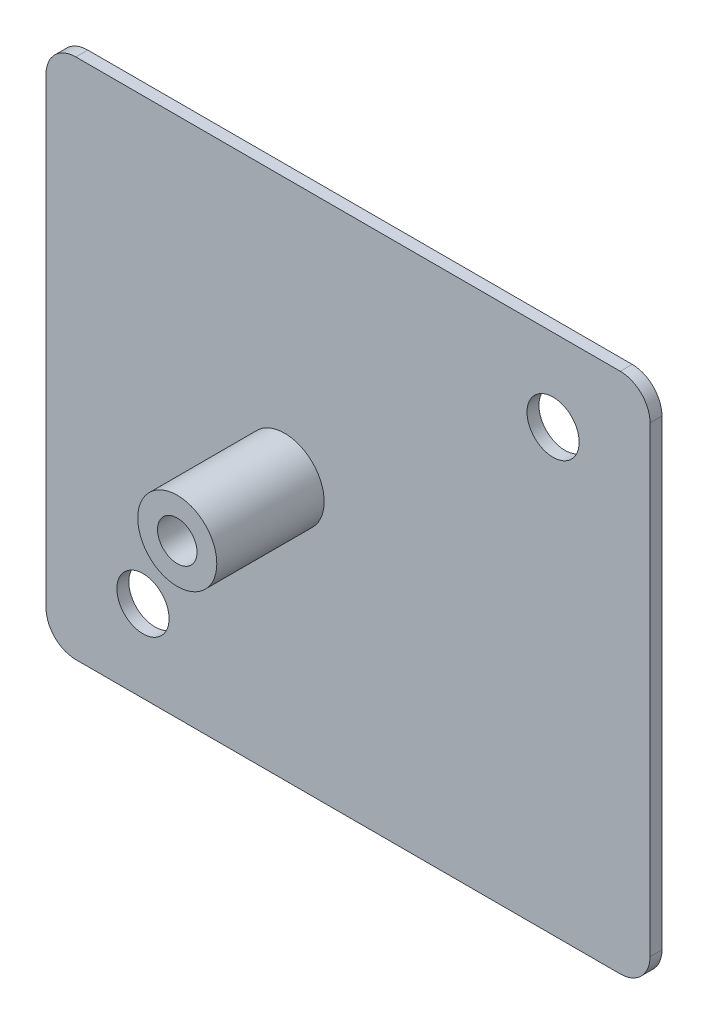
ISO-10303-21;
HEADER;
FILE_DESCRIPTION(('STEP AP214'),'2;1');
FILE_NAME('part.step','',(''),(''),'','','');
FILE_SCHEMA(('AUTOMOTIVE_DESIGN { 1 0 10303 214 1 1 1 1 }'));
ENDSEC;
DATA;
#1=APPLICATION_CONTEXT('core data for automotive mechanical design processes');
#2=APPLICATION_PROTOCOL_DEFINITION('international standard','automotive_design',2000,#1);
#3=PRODUCT_CONTEXT('',#1,'mechanical');
#4=PRODUCT('Part','Part','',(#3));
#5=PRODUCT_RELATED_PRODUCT_CATEGORY('part','',(#4));
#6=PRODUCT_DEFINITION_FORMATION('','',#4);
#7=PRODUCT_DEFINITION_CONTEXT('part definition',#1,'design');
#8=PRODUCT_DEFINITION('design','',#6,#7);
#9=PRODUCT_DEFINITION_SHAPE('','',#8);
#10=(LENGTH_UNIT() NAMED_UNIT(*) SI_UNIT(.MILLI.,.METRE.));
#11=(NAMED_UNIT(*) PLANE_ANGLE_UNIT() SI_UNIT($,.RADIAN.));
#12=(NAMED_UNIT(*) SI_UNIT($,.STERADIAN.) SOLID_ANGLE_UNIT());
#13=UNCERTAINTY_MEASURE_WITH_UNIT(LENGTH_MEASURE(1.E-05),#10,'distance_accuracy_value','');
#14=(GEOMETRIC_REPRESENTATION_CONTEXT(3) GLOBAL_UNCERTAINTY_ASSIGNED_CONTEXT((#13)) GLOBAL_UNIT_ASSIGNED_CONTEXT((#10,
#11,#12)) REPRESENTATION_CONTEXT('',''));
#15=CARTESIAN_POINT('',(0.,0.,0.));
#16=DIRECTION('',(0.,0.,1.));
#17=DIRECTION('',(1.,0.,0.));
#18=AXIS2_PLACEMENT_3D('',#15,#16,#17);
#19=CARTESIAN_POINT('',(20.25,-17.5,-0.8));
#20=DIRECTION('',(1.,0.,0.));
#21=DIRECTION('',(0.,0.,-1.));
#22=AXIS2_PLACEMENT_3D('',#19,#20,#21);
#23=PLANE('',#22);
#24=DIRECTION('',(0.,1.,0.));
#25=VECTOR('',#24,1.);
#26=CARTESIAN_POINT('',(20.25,-17.5,0.));
#27=LINE('',#26,#25);
#28=CARTESIAN_POINT('',(20.25,-15.5,0.));
#29=VERTEX_POINT('',#28);
#30=CARTESIAN_POINT('',(20.25,15.5,0.));
#31=VERTEX_POINT('',#30);
#32=EDGE_CURVE('E90',#29,#31,#27,.T.);
#33=ORIENTED_EDGE('',*,*,#32,.F.);
#34=DIRECTION('',(0.,0.,1.));
#35=VECTOR('',#34,1.);
#36=CARTESIAN_POINT('',(20.25,-15.5,-0.8));
#37=LINE('',#36,#35);
#38=CARTESIAN_POINT('',(20.25,-15.5,-0.8));
#39=VERTEX_POINT('',#38);
#40=EDGE_CURVE('E25',#29,#39,#37,.F.);
#41=ORIENTED_EDGE('',*,*,#40,.T.);
#42=DIRECTION('',(0.,1.,0.));
#43=VECTOR('',#42,1.);
#44=CARTESIAN_POINT('',(20.25,-17.5,-0.8));
#45=LINE('',#44,#43);
#46=CARTESIAN_POINT('',(20.25,15.5,-0.8));
#47=VERTEX_POINT('',#46);
#48=EDGE_CURVE('E143',#39,#47,#45,.T.);
#49=ORIENTED_EDGE('',*,*,#48,.T.);
#50=DIRECTION('',(0.,0.,1.));
#51=VECTOR('',#50,1.);
#52=CARTESIAN_POINT('',(20.25,15.5,-0.8));
#53=LINE('',#52,#51);
#54=EDGE_CURVE('E140',#47,#31,#53,.T.);
#55=ORIENTED_EDGE('',*,*,#54,.T.);
#56=EDGE_LOOP('',(#33,#41,#49,#55));
#57=FACE_BOUND('',#56,.T.);
#58=ADVANCED_FACE('F17',(#57),#23,.T.);
#59=CARTESIAN_POINT('',(-20.25,-17.5,-0.8));
#60=DIRECTION('',(0.,-1.,0.));
#61=DIRECTION('',(0.,0.,-1.));
#62=AXIS2_PLACEMENT_3D('',#59,#60,#61);
#63=PLANE('',#62);
#64=DIRECTION('',(1.,0.,0.));
#65=VECTOR('',#64,1.);
#66=CARTESIAN_POINT('',(-20.25,-17.5,0.));
#67=LINE('',#66,#65);
#68=CARTESIAN_POINT('',(-18.25,-17.5,0.));
#69=VERTEX_POINT('',#68);
#70=CARTESIAN_POINT('',(18.25,-17.5,0.));
#71=VERTEX_POINT('',#70);
#72=EDGE_CURVE('E111',#69,#71,#67,.T.);
#73=ORIENTED_EDGE('',*,*,#72,.F.);
#74=DIRECTION('',(0.,0.,1.));
#75=VECTOR('',#74,1.);
#76=CARTESIAN_POINT('',(-18.25,-17.5,-0.8));
#77=LINE('',#76,#75);
#78=CARTESIAN_POINT('',(-18.25,-17.5,-0.8));
#79=VERTEX_POINT('',#78);
#80=EDGE_CURVE('E39',#69,#79,#77,.F.);
#81=ORIENTED_EDGE('',*,*,#80,.T.);
#82=DIRECTION('',(1.,0.,0.));
#83=VECTOR('',#82,1.);
#84=CARTESIAN_POINT('',(-20.25,-17.5,-0.8));
#85=LINE('',#84,#83);
#86=CARTESIAN_POINT('',(18.25,-17.5,-0.8));
#87=VERTEX_POINT('',#86);
#88=EDGE_CURVE('E107',#79,#87,#85,.T.);
#89=ORIENTED_EDGE('',*,*,#88,.T.);
#90=DIRECTION('',(0.,0.,1.));
#91=VECTOR('',#90,1.);
#92=CARTESIAN_POINT('',(18.25,-17.5,-0.8));
#93=LINE('',#92,#91);
#94=EDGE_CURVE('E132',#87,#71,#93,.T.);
#95=ORIENTED_EDGE('',*,*,#94,.T.);
#96=EDGE_LOOP('',(#73,#81,#89,#95));
#97=FACE_BOUND('',#96,.T.);
#98=ADVANCED_FACE('F147',(#97),#63,.T.);
#99=CARTESIAN_POINT('',(-20.25,-17.5,-0.8));
#100=DIRECTION('',(-1.,0.,0.));
#101=DIRECTION('',(0.,0.,1.));
#102=AXIS2_PLACEMENT_3D('',#99,#100,#101);
#103=PLANE('',#102);
#104=DIRECTION('',(0.,-1.,0.));
#105=VECTOR('',#104,1.);
#106=CARTESIAN_POINT('',(-20.25,-17.5,0.));
#107=LINE('',#106,#105);
#108=CARTESIAN_POINT('',(-20.25,15.5,0.));
#109=VERTEX_POINT('',#108);
#110=CARTESIAN_POINT('',(-20.25,-15.5,0.));
#111=VERTEX_POINT('',#110);
#112=EDGE_CURVE('E102',#109,#111,#107,.T.);
#113=ORIENTED_EDGE('',*,*,#112,.F.);
#114=DIRECTION('',(0.,0.,1.));
#115=VECTOR('',#114,1.);
#116=CARTESIAN_POINT('',(-20.25,15.5,-0.8));
#117=LINE('',#116,#115);
#118=CARTESIAN_POINT('',(-20.25,15.5,-0.8));
#119=VERTEX_POINT('',#118);
#120=EDGE_CURVE('E123',#109,#119,#117,.F.);
#121=ORIENTED_EDGE('',*,*,#120,.T.);
#122=DIRECTION('',(0.,-1.,0.));
#123=VECTOR('',#122,1.);
#124=CARTESIAN_POINT('',(-20.25,-17.5,-0.8));
#125=LINE('',#124,#123);
#126=CARTESIAN_POINT('',(-20.25,-15.5,-0.8));
#127=VERTEX_POINT('',#126);
#128=EDGE_CURVE('E112',#119,#127,#125,.T.);
#129=ORIENTED_EDGE('',*,*,#128,.T.);
#130=DIRECTION('',(0.,0.,1.));
#131=VECTOR('',#130,1.);
#132=CARTESIAN_POINT('',(-20.25,-15.5,-0.8));
#133=LINE('',#132,#131);
#134=EDGE_CURVE('E125',#127,#111,#133,.T.);
#135=ORIENTED_EDGE('',*,*,#134,.T.);
#136=EDGE_LOOP('',(#113,#121,#129,#135));
#137=FACE_BOUND('',#136,.T.);
#138=ADVANCED_FACE('F201',(#137),#103,.T.);
#139=CARTESIAN_POINT('',(-20.25,17.5,-0.8));
#140=DIRECTION('',(0.,1.,0.));
#141=DIRECTION('',(0.,0.,1.));
#142=AXIS2_PLACEMENT_3D('',#139,#140,#141);
#143=PLANE('',#142);
#144=DIRECTION('',(-1.,0.,0.));
#145=VECTOR('',#144,1.);
#146=CARTESIAN_POINT('',(-20.25,17.5,-0.8));
#147=LINE('',#146,#145);
#148=CARTESIAN_POINT('',(18.25,17.5,-0.8));
#149=VERTEX_POINT('',#148);
#150=CARTESIAN_POINT('',(-18.25,17.5,-0.8));
#151=VERTEX_POINT('',#150);
#152=EDGE_CURVE('E144',#149,#151,#147,.T.);
#153=ORIENTED_EDGE('',*,*,#152,.T.);
#154=DIRECTION('',(0.,0.,1.));
#155=VECTOR('',#154,1.);
#156=CARTESIAN_POINT('',(-18.25,17.5,-0.8));
#157=LINE('',#156,#155);
#158=CARTESIAN_POINT('',(-18.25,17.5,0.));
#159=VERTEX_POINT('',#158);
#160=EDGE_CURVE('E92',#151,#159,#157,.T.);
#161=ORIENTED_EDGE('',*,*,#160,.T.);
#162=DIRECTION('',(-1.,0.,0.));
#163=VECTOR('',#162,1.);
#164=CARTESIAN_POINT('',(-20.25,17.5,0.));
#165=LINE('',#164,#163);
#166=CARTESIAN_POINT('',(18.25,17.5,0.));
#167=VERTEX_POINT('',#166);
#168=EDGE_CURVE('E87',#167,#159,#165,.T.);
#169=ORIENTED_EDGE('',*,*,#168,.F.);
#170=DIRECTION('',(0.,0.,1.));
#171=VECTOR('',#170,1.);
#172=CARTESIAN_POINT('',(18.25,17.5,-0.8));
#173=LINE('',#172,#171);
#174=EDGE_CURVE('E101',#167,#149,#173,.F.);
#175=ORIENTED_EDGE('',*,*,#174,.T.);
#176=EDGE_LOOP('',(#153,#161,#169,#175));
#177=FACE_BOUND('',#176,.T.);
#178=ADVANCED_FACE('F99',(#177),#143,.T.);
#179=CARTESIAN_POINT('',(0.,0.,-0.8));
#180=DIRECTION('',(0.,0.,-1.));
#181=DIRECTION('',(-1.,0.,0.));
#182=AXIS2_PLACEMENT_3D('',#179,#180,#181);
#183=PLANE('',#182);
#184=CARTESIAN_POINT('',(-13.75,-12.,-0.8));
#185=DIRECTION('',(0.,0.,1.));
#186=DIRECTION('',(1.,0.,0.));
#187=AXIS2_PLACEMENT_3D('',#184,#185,#186);
#188=CIRCLE('',#187,1.75);
#189=CARTESIAN_POINT('',(-12.,-12.,-0.8));
#190=VERTEX_POINT('',#189);
#191=EDGE_CURVE('E165',#190,#190,#188,.T.);
#192=ORIENTED_EDGE('',*,*,#191,.T.);
#193=EDGE_LOOP('',(#192));
#194=FACE_BOUND('',#193,.T.);
#195=CARTESIAN_POINT('',(13.75,12.,-0.8));
#196=DIRECTION('',(0.,0.,1.));
#197=DIRECTION('',(1.,0.,0.));
#198=AXIS2_PLACEMENT_3D('',#195,#196,#197);
#199=CIRCLE('',#198,1.75);
#200=CARTESIAN_POINT('',(15.5,12.,-0.8));
#201=VERTEX_POINT('',#200);
#202=EDGE_CURVE('E152',#201,#201,#199,.T.);
#203=ORIENTED_EDGE('',*,*,#202,.T.);
#204=EDGE_LOOP('',(#203));
#205=FACE_BOUND('',#204,.T.);
#206=ORIENTED_EDGE('',*,*,#128,.F.);
#207=CARTESIAN_POINT('',(-18.25,15.5,-0.8));
#208=DIRECTION('',(0.,0.,-1.));
#209=DIRECTION('',(-1.,0.,0.));
#210=AXIS2_PLACEMENT_3D('',#207,#208,#209);
#211=CIRCLE('',#210,2.);
#212=EDGE_CURVE('E131',#119,#151,#211,.T.);
#213=ORIENTED_EDGE('',*,*,#212,.T.);
#214=ORIENTED_EDGE('',*,*,#152,.F.);
#215=CARTESIAN_POINT('',(18.25,15.5,-0.8));
#216=DIRECTION('',(0.,0.,-1.));
#217=DIRECTION('',(-1.,0.,0.));
#218=AXIS2_PLACEMENT_3D('',#215,#216,#217);
#219=CIRCLE('',#218,2.);
#220=EDGE_CURVE('E110',#149,#47,#219,.T.);
#221=ORIENTED_EDGE('',*,*,#220,.T.);
#222=ORIENTED_EDGE('',*,*,#48,.F.);
#223=CARTESIAN_POINT('',(18.25,-15.5,-0.8));
#224=DIRECTION('',(0.,0.,-1.));
#225=DIRECTION('',(-1.,0.,0.));
#226=AXIS2_PLACEMENT_3D('',#223,#224,#225);
#227=CIRCLE('',#226,2.);
#228=EDGE_CURVE('E32',#39,#87,#227,.T.);
#229=ORIENTED_EDGE('',*,*,#228,.T.);
#230=ORIENTED_EDGE('',*,*,#88,.F.);
#231=CARTESIAN_POINT('',(-18.25,-15.5,-0.8));
#232=DIRECTION('',(0.,0.,-1.));
#233=DIRECTION('',(-1.,0.,0.));
#234=AXIS2_PLACEMENT_3D('',#231,#232,#233);
#235=CIRCLE('',#234,2.);
#236=EDGE_CURVE('E127',#79,#127,#235,.T.);
#237=ORIENTED_EDGE('',*,*,#236,.T.);
#238=EDGE_LOOP('',(#206,#213,#214,#221,#222,#229,#230,#237));
#239=FACE_BOUND('',#238,.T.);
#240=ADVANCED_FACE('F145',(#194,#205,#239),#183,.T.);
#241=CARTESIAN_POINT('',(0.,0.,0.));
#242=DIRECTION('',(0.,0.,-1.));
#243=DIRECTION('',(-1.,0.,0.));
#244=AXIS2_PLACEMENT_3D('',#241,#242,#243);
#245=PLANE('',#244);
#246=CARTESIAN_POINT('',(-4.25,0.,0.));
#247=DIRECTION('',(0.,0.,-1.));
#248=DIRECTION('',(-1.,0.,0.));
#249=AXIS2_PLACEMENT_3D('',#246,#247,#248);
#250=CIRCLE('',#249,2.65);
#251=CARTESIAN_POINT('',(-6.9,0.,0.));
#252=VERTEX_POINT('',#251);
#253=EDGE_CURVE('E11',#252,#252,#250,.F.);
#254=ORIENTED_EDGE('',*,*,#253,.F.);
#255=EDGE_LOOP('',(#254));
#256=FACE_BOUND('',#255,.T.);
#257=CARTESIAN_POINT('',(-13.75,-12.,0.));
#258=DIRECTION('',(0.,0.,1.));
#259=DIRECTION('',(1.,0.,0.));
#260=AXIS2_PLACEMENT_3D('',#257,#258,#259);
#261=CIRCLE('',#260,1.75);
#262=CARTESIAN_POINT('',(-12.,-12.,0.));
#263=VERTEX_POINT('',#262);
#264=EDGE_CURVE('E164',#263,#263,#261,.T.);
#265=ORIENTED_EDGE('',*,*,#264,.F.);
#266=EDGE_LOOP('',(#265));
#267=FACE_BOUND('',#266,.T.);
#268=CARTESIAN_POINT('',(13.75,12.,0.));
#269=DIRECTION('',(0.,0.,1.));
#270=DIRECTION('',(1.,0.,0.));
#271=AXIS2_PLACEMENT_3D('',#268,#269,#270);
#272=CIRCLE('',#271,1.75);
#273=CARTESIAN_POINT('',(15.5,12.,0.));
#274=VERTEX_POINT('',#273);
#275=EDGE_CURVE('E157',#274,#274,#272,.T.);
#276=ORIENTED_EDGE('',*,*,#275,.F.);
#277=EDGE_LOOP('',(#276));
#278=FACE_BOUND('',#277,.T.);
#279=ORIENTED_EDGE('',*,*,#168,.T.);
#280=CARTESIAN_POINT('',(-18.25,15.5,0.));
#281=DIRECTION('',(0.,0.,-1.));
#282=DIRECTION('',(-1.,0.,0.));
#283=AXIS2_PLACEMENT_3D('',#280,#281,#282);
#284=CIRCLE('',#283,2.);
#285=EDGE_CURVE('E120',#159,#109,#284,.F.);
#286=ORIENTED_EDGE('',*,*,#285,.T.);
#287=ORIENTED_EDGE('',*,*,#112,.T.);
#288=CARTESIAN_POINT('',(-18.25,-15.5,0.));
#289=DIRECTION('',(0.,0.,-1.));
#290=DIRECTION('',(-1.,0.,0.));
#291=AXIS2_PLACEMENT_3D('',#288,#289,#290);
#292=CIRCLE('',#291,2.);
#293=EDGE_CURVE('E119',#111,#69,#292,.F.);
#294=ORIENTED_EDGE('',*,*,#293,.T.);
#295=ORIENTED_EDGE('',*,*,#72,.T.);
#296=CARTESIAN_POINT('',(18.25,-15.5,0.));
#297=DIRECTION('',(0.,0.,-1.));
#298=DIRECTION('',(-1.,0.,0.));
#299=AXIS2_PLACEMENT_3D('',#296,#297,#298);
#300=CIRCLE('',#299,2.);
#301=EDGE_CURVE('E94',#71,#29,#300,.F.);
#302=ORIENTED_EDGE('',*,*,#301,.T.);
#303=ORIENTED_EDGE('',*,*,#32,.T.);
#304=CARTESIAN_POINT('',(18.25,15.5,0.));
#305=DIRECTION('',(0.,0.,-1.));
#306=DIRECTION('',(-1.,0.,0.));
#307=AXIS2_PLACEMENT_3D('',#304,#305,#306);
#308=CIRCLE('',#307,2.);
#309=EDGE_CURVE('E81',#31,#167,#308,.F.);
#310=ORIENTED_EDGE('',*,*,#309,.T.);
#311=EDGE_LOOP('',(#279,#286,#287,#294,#295,#302,#303,#310));
#312=FACE_BOUND('',#311,.T.);
#313=ADVANCED_FACE('F88',(#256,#267,#278,#312),#245,.F.);
#314=CARTESIAN_POINT('',(13.75,12.,-0.8));
#315=DIRECTION('',(0.,0.,1.));
#316=DIRECTION('',(1.,0.,0.));
#317=AXIS2_PLACEMENT_3D('',#314,#315,#316);
#318=CYLINDRICAL_SURFACE('',#317,1.75);
#319=ORIENTED_EDGE('',*,*,#202,.F.);
#320=EDGE_LOOP('',(#319));
#321=FACE_BOUND('',#320,.T.);
#322=ORIENTED_EDGE('',*,*,#275,.T.);
#323=EDGE_LOOP('',(#322));
#324=FACE_BOUND('',#323,.T.);
#325=ADVANCED_FACE('F252',(#321,#324),#318,.F.);
#326=CARTESIAN_POINT('',(-13.75,-12.,-0.8));
#327=DIRECTION('',(0.,0.,1.));
#328=DIRECTION('',(1.,0.,0.));
#329=AXIS2_PLACEMENT_3D('',#326,#327,#328);
#330=CYLINDRICAL_SURFACE('',#329,1.75);
#331=ORIENTED_EDGE('',*,*,#191,.F.);
#332=EDGE_LOOP('',(#331));
#333=FACE_BOUND('',#332,.T.);
#334=ORIENTED_EDGE('',*,*,#264,.T.);
#335=EDGE_LOOP('',(#334));
#336=FACE_BOUND('',#335,.T.);
#337=ADVANCED_FACE('F215',(#333,#336),#330,.F.);
#338=CARTESIAN_POINT('',(-18.25,15.5,-0.8));
#339=DIRECTION('',(0.,0.,1.));
#340=DIRECTION('',(1.,0.,0.));
#341=AXIS2_PLACEMENT_3D('',#338,#339,#340);
#342=CYLINDRICAL_SURFACE('',#341,2.);
#343=ORIENTED_EDGE('',*,*,#212,.F.);
#344=ORIENTED_EDGE('',*,*,#120,.F.);
#345=ORIENTED_EDGE('',*,*,#285,.F.);
#346=ORIENTED_EDGE('',*,*,#160,.F.);
#347=EDGE_LOOP('',(#343,#344,#345,#346));
#348=FACE_BOUND('',#347,.T.);
#349=ADVANCED_FACE('F208',(#348),#342,.T.);
#350=CARTESIAN_POINT('',(-18.25,-15.5,-0.8));
#351=DIRECTION('',(0.,0.,1.));
#352=DIRECTION('',(1.,0.,0.));
#353=AXIS2_PLACEMENT_3D('',#350,#351,#352);
#354=CYLINDRICAL_SURFACE('',#353,2.);
#355=ORIENTED_EDGE('',*,*,#236,.F.);
#356=ORIENTED_EDGE('',*,*,#80,.F.);
#357=ORIENTED_EDGE('',*,*,#293,.F.);
#358=ORIENTED_EDGE('',*,*,#134,.F.);
#359=EDGE_LOOP('',(#355,#356,#357,#358));
#360=FACE_BOUND('',#359,.T.);
#361=ADVANCED_FACE('F211',(#360),#354,.T.);
#362=CARTESIAN_POINT('',(18.25,-15.5,-0.8));
#363=DIRECTION('',(0.,0.,1.));
#364=DIRECTION('',(1.,0.,0.));
#365=AXIS2_PLACEMENT_3D('',#362,#363,#364);
#366=CYLINDRICAL_SURFACE('',#365,2.);
#367=ORIENTED_EDGE('',*,*,#228,.F.);
#368=ORIENTED_EDGE('',*,*,#40,.F.);
#369=ORIENTED_EDGE('',*,*,#301,.F.);
#370=ORIENTED_EDGE('',*,*,#94,.F.);
#371=EDGE_LOOP('',(#367,#368,#369,#370));
#372=FACE_BOUND('',#371,.T.);
#373=ADVANCED_FACE('F146',(#372),#366,.T.);
#374=CARTESIAN_POINT('',(18.25,15.5,-0.8));
#375=DIRECTION('',(0.,0.,1.));
#376=DIRECTION('',(1.,0.,0.));
#377=AXIS2_PLACEMENT_3D('',#374,#375,#376);
#378=CYLINDRICAL_SURFACE('',#377,2.);
#379=ORIENTED_EDGE('',*,*,#220,.F.);
#380=ORIENTED_EDGE('',*,*,#174,.F.);
#381=ORIENTED_EDGE('',*,*,#309,.F.);
#382=ORIENTED_EDGE('',*,*,#54,.F.);
#383=EDGE_LOOP('',(#379,#380,#381,#382));
#384=FACE_BOUND('',#383,.T.);
#385=ADVANCED_FACE('F19',(#384),#378,.T.);
#386=CARTESIAN_POINT('',(-4.25,0.,7.2));
#387=DIRECTION('',(0.,0.,1.));
#388=DIRECTION('',(1.,0.,0.));
#389=AXIS2_PLACEMENT_3D('',#386,#387,#388);
#390=PLANE('',#389);
#391=CARTESIAN_POINT('',(-4.25,0.,7.2));
#392=DIRECTION('',(0.,0.,1.));
#393=DIRECTION('',(1.,0.,0.));
#394=AXIS2_PLACEMENT_3D('',#391,#392,#393);
#395=CIRCLE('',#394,2.65);
#396=CARTESIAN_POINT('',(-1.6,0.,7.2));
#397=VERTEX_POINT('',#396);
#398=EDGE_CURVE('E169',#397,#397,#395,.T.);
#399=ORIENTED_EDGE('',*,*,#398,.T.);
#400=EDGE_LOOP('',(#399));
#401=FACE_BOUND('',#400,.T.);
#402=CARTESIAN_POINT('',(-4.25,0.,7.2));
#403=DIRECTION('',(0.,0.,1.));
#404=DIRECTION('',(1.,0.,0.));
#405=AXIS2_PLACEMENT_3D('',#402,#403,#404);
#406=CIRCLE('',#405,1.325);
#407=CARTESIAN_POINT('',(-2.925,0.,7.2));
#408=VERTEX_POINT('',#407);
#409=EDGE_CURVE('E174',#408,#408,#406,.T.);
#410=ORIENTED_EDGE('',*,*,#409,.F.);
#411=EDGE_LOOP('',(#410));
#412=FACE_BOUND('',#411,.T.);
#413=ADVANCED_FACE('F183',(#401,#412),#390,.T.);
#414=CARTESIAN_POINT('',(-4.25,0.,7.2));
#415=DIRECTION('',(0.,0.,-1.));
#416=DIRECTION('',(-1.,0.,0.));
#417=AXIS2_PLACEMENT_3D('',#414,#415,#416);
#418=CYLINDRICAL_SURFACE('',#417,2.65);
#419=ORIENTED_EDGE('',*,*,#398,.F.);
#420=EDGE_LOOP('',(#419));
#421=FACE_BOUND('',#420,.T.);
#422=ORIENTED_EDGE('',*,*,#253,.T.);
#423=EDGE_LOOP('',(#422));
#424=FACE_BOUND('',#423,.T.);
#425=ADVANCED_FACE('F184',(#421,#424),#418,.T.);
#426=CARTESIAN_POINT('',(-4.25,0.,7.2));
#427=DIRECTION('',(0.,0.,-1.));
#428=DIRECTION('',(-1.,0.,0.));
#429=AXIS2_PLACEMENT_3D('',#426,#427,#428);
#430=CYLINDRICAL_SURFACE('',#429,1.325);
#431=ORIENTED_EDGE('',*,*,#409,.T.);
#432=EDGE_LOOP('',(#431));
#433=FACE_BOUND('',#432,.T.);
#434=CARTESIAN_POINT('',(-4.25,0.,0.));
#435=DIRECTION('',(0.,0.,1.));
#436=DIRECTION('',(1.,0.,0.));
#437=AXIS2_PLACEMENT_3D('',#434,#435,#436);
#438=CIRCLE('',#437,1.325);
#439=CARTESIAN_POINT('',(-2.925,0.,0.));
#440=VERTEX_POINT('',#439);
#441=EDGE_CURVE('E173',#440,#440,#438,.T.);
#442=ORIENTED_EDGE('',*,*,#441,.F.);
#443=EDGE_LOOP('',(#442));
#444=FACE_BOUND('',#443,.T.);
#445=ADVANCED_FACE('F178',(#433,#444),#430,.F.);
#446=ORIENTED_EDGE('',*,*,#441,.T.);
#447=EDGE_LOOP('',(#446));
#448=FACE_BOUND('',#447,.T.);
#449=ADVANCED_FACE('F267',(#448),#245,.F.);
#450=CLOSED_SHELL('',(#58,#98,#138,#178,#240,#313,#325,#337,#349,#361,#373,#385,#413,#425,#445,#449));
#451=MANIFOLD_SOLID_BREP('B1',#450);
#452=ADVANCED_BREP_SHAPE_REPRESENTATION('',(#18,#451),#14);
#453=SHAPE_DEFINITION_REPRESENTATION(#9,#452);
ENDSEC;
END-ISO-10303-21;
